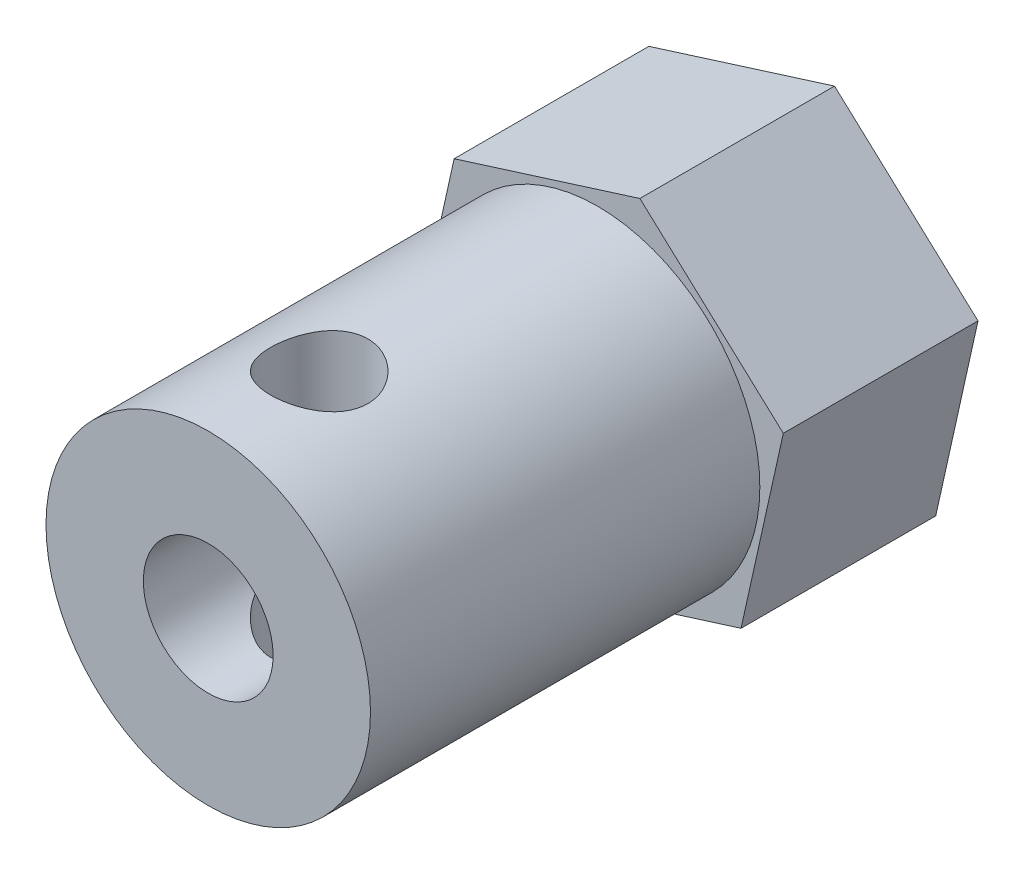
ISO-10303-21;
HEADER;
FILE_DESCRIPTION(('STEP AP214'),'2;1');
FILE_NAME('part.step','',(''),(''),'','','');
FILE_SCHEMA(('AUTOMOTIVE_DESIGN { 1 0 10303 214 1 1 1 1 }'));
ENDSEC;
DATA;
#1=APPLICATION_CONTEXT('core data for automotive mechanical design processes');
#2=APPLICATION_PROTOCOL_DEFINITION('international standard','automotive_design',2000,#1);
#3=PRODUCT_CONTEXT('',#1,'mechanical');
#4=PRODUCT('Part','Part','',(#3));
#5=PRODUCT_RELATED_PRODUCT_CATEGORY('part','',(#4));
#6=PRODUCT_DEFINITION_FORMATION('','',#4);
#7=PRODUCT_DEFINITION_CONTEXT('part definition',#1,'design');
#8=PRODUCT_DEFINITION('design','',#6,#7);
#9=PRODUCT_DEFINITION_SHAPE('','',#8);
#10=(LENGTH_UNIT() NAMED_UNIT(*) SI_UNIT(.MILLI.,.METRE.));
#11=(NAMED_UNIT(*) PLANE_ANGLE_UNIT() SI_UNIT($,.RADIAN.));
#12=(NAMED_UNIT(*) SI_UNIT($,.STERADIAN.) SOLID_ANGLE_UNIT());
#13=UNCERTAINTY_MEASURE_WITH_UNIT(LENGTH_MEASURE(1.E-05),#10,'distance_accuracy_value','');
#14=(GEOMETRIC_REPRESENTATION_CONTEXT(3) GLOBAL_UNCERTAINTY_ASSIGNED_CONTEXT((#13)) GLOBAL_UNIT_ASSIGNED_CONTEXT((#10,
#11,#12)) REPRESENTATION_CONTEXT('',''));
#15=CARTESIAN_POINT('',(0.,0.,0.));
#16=DIRECTION('',(0.,0.,1.));
#17=DIRECTION('',(1.,0.,0.));
#18=AXIS2_PLACEMENT_3D('',#15,#16,#17);
#19=CARTESIAN_POINT('',(0.,-6.,14.58047771158));
#20=DIRECTION('',(0.,1.,0.));
#21=DIRECTION('',(0.,0.,1.));
#22=AXIS2_PLACEMENT_3D('',#19,#20,#21);
#23=CYLINDRICAL_SURFACE('',#22,1.5);
#24=CARTESIAN_POINT('',(0.,-2.,16.08047771158));
#25=CARTESIAN_POINT('',(0.0732207358411543,-1.99999540196395,16.080472919568));
#26=CARTESIAN_POINT('',(0.146561062021485,-1.99593645526274,16.0750726872055));
#27=CARTESIAN_POINT('',(0.290936396286467,-1.98006607281083,16.0538106481698));
#28=CARTESIAN_POINT('',(0.361965136229004,-1.96823514679854,16.0379225399299));
#29=CARTESIAN_POINT('',(0.499234626631249,-1.9379567495606,15.9967648022962));
#30=CARTESIAN_POINT('',(0.565501615403736,-1.91954951932009,15.9715521980108));
#31=CARTESIAN_POINT('',(0.692422335520752,-1.87750556721694,15.9129353673928));
#32=CARTESIAN_POINT('',(0.753077701796332,-1.85387037535483,15.8795335373865));
#33=CARTESIAN_POINT('',(0.873465937590145,-1.80049544543983,15.8022146999892));
#34=CARTESIAN_POINT('',(0.932593229272033,-1.77039308548439,15.7576103822459));
#35=CARTESIAN_POINT('',(1.04302716767671,-1.70767017883378,15.6609818742188));
#36=CARTESIAN_POINT('',(1.09432148272226,-1.67504578078609,15.6089462287802));
#37=CARTESIAN_POINT('',(1.19837161436623,-1.6027112365199,15.4868947583016));
#38=CARTESIAN_POINT('',(1.24930578421204,-1.56290854864639,15.4153740344583));
#39=CARTESIAN_POINT('',(1.33861998176348,-1.48711444664135,15.2630266992135));
#40=CARTESIAN_POINT('',(1.37701716983077,-1.45111786883675,15.1822130145797));
#41=CARTESIAN_POINT('',(1.42880627811788,-1.39977155180179,15.0409748729038));
#42=CARTESIAN_POINT('',(1.44625674456539,-1.38157751186733,14.9830870144516));
#43=CARTESIAN_POINT('',(1.47420672564844,-1.35171594150685,14.8640849767951));
#44=CARTESIAN_POINT('',(1.48472215355267,-1.34003347910832,14.8029785337052));
#45=CARTESIAN_POINT('',(1.49812822141445,-1.32503759684553,14.6782951260492));
#46=CARTESIAN_POINT('',(1.50094954854207,-1.32180026676597,14.6147009048559));
#47=CARTESIAN_POINT('',(1.49848213241869,-1.32459531776068,14.4878628006984));
#48=CARTESIAN_POINT('',(1.49319048157349,-1.33063102218113,14.4246190514926));
#49=CARTESIAN_POINT('',(1.47597739291882,-1.34967623262519,14.3072863641542));
#50=CARTESIAN_POINT('',(1.46482486380817,-1.36187157059871,14.2529413405338));
#51=CARTESIAN_POINT('',(1.43705671120733,-1.39114192844939,14.1470388328591));
#52=CARTESIAN_POINT('',(1.42043583681172,-1.40822163640769,14.0954840837564));
#53=CARTESIAN_POINT('',(1.37033064172535,-1.45741769294306,13.9642213249459));
#54=CARTESIAN_POINT('',(1.3328014849398,-1.49225649139232,13.8870772949365));
#55=CARTESIAN_POINT('',(1.24618023314519,-1.56533298145196,13.7412811877109));
#56=CARTESIAN_POINT('',(1.19706004255879,-1.60357878886109,13.6726503723253));
#57=CARTESIAN_POINT('',(1.08651604102136,-1.68051672313145,13.5427243211763));
#58=CARTESIAN_POINT('',(1.02481375526037,-1.71919586730239,13.4816571046985));
#59=CARTESIAN_POINT('',(0.890422521709593,-1.79248037980972,13.3702140647988));
#60=CARTESIAN_POINT('',(0.817755054293761,-1.8270934826376,13.3198177913496));
#61=CARTESIAN_POINT('',(0.677902080454147,-1.88279726073643,13.2404969123397));
#62=CARTESIAN_POINT('',(0.612539870185624,-1.90520770945008,13.2092931173642));
#63=CARTESIAN_POINT('',(0.476352173202091,-1.94372904416947,13.1562528311161));
#64=CARTESIAN_POINT('',(0.405530141063771,-1.95984387504351,13.1344104730807));
#65=CARTESIAN_POINT('',(0.259676232483523,-1.98445588635989,13.1012243486936));
#66=CARTESIAN_POINT('',(0.184621281405948,-1.99290592971749,13.0899455326414));
#67=CARTESIAN_POINT('',(0.0332012397969221,-2.00115883659445,13.0789281142083));
#68=CARTESIAN_POINT('',(-0.0431632843727186,-2.00096534845408,13.0791846428846));
#69=CARTESIAN_POINT('',(-0.186804217329621,-1.99242547175873,13.0905885808532));
#70=CARTESIAN_POINT('',(-0.254222327546129,-1.98490086600401,13.1006382484687));
#71=CARTESIAN_POINT('',(-0.386110670609114,-1.96351320201588,13.1294514915879));
#72=CARTESIAN_POINT('',(-0.450580272987257,-1.94964879507262,13.1482169212694));
#73=CARTESIAN_POINT('',(-0.577416779689765,-1.91599830683313,13.1943652421731));
#74=CARTESIAN_POINT('',(-0.639629172536135,-1.89602050290194,13.2220288930074));
#75=CARTESIAN_POINT('',(-0.758518527043069,-1.85166985411963,13.2846501670056));
#76=CARTESIAN_POINT('',(-0.815194721336399,-1.82729640132068,13.3196087992197));
#77=CARTESIAN_POINT('',(-0.931511626319033,-1.77119146886499,13.4022609579906));
#78=CARTESIAN_POINT('',(-0.990066762698698,-1.73891095025037,13.4511062510174));
#79=CARTESIAN_POINT('',(-1.09871974855853,-1.67238952874785,13.5564864641684));
#80=CARTESIAN_POINT('',(-1.14879830469576,-1.63814438507395,13.6130384112733));
#81=CARTESIAN_POINT('',(-1.24877541075626,-1.56369128291497,13.7446275925412));
#82=CARTESIAN_POINT('',(-1.29683043648704,-1.52358718520101,13.8211352730723));
#83=CARTESIAN_POINT('',(-1.37923235998282,-1.44940591348451,13.9838377895524));
#84=CARTESIAN_POINT('',(-1.41362000515519,-1.41531099570969,14.0700028334886));
#85=CARTESIAN_POINT('',(-1.45615734256767,-1.37118877808583,14.2158921604545));
#86=CARTESIAN_POINT('',(-1.46931009512995,-1.35695811824565,14.2728688379824));
#87=CARTESIAN_POINT('',(-1.48891522181906,-1.33542056103011,14.3891847585632));
#88=CARTESIAN_POINT('',(-1.4953825519924,-1.32809821220233,14.4485184183822));
#89=CARTESIAN_POINT('',(-1.50115320209064,-1.32157601792209,14.5683067913913));
#90=CARTESIAN_POINT('',(-1.50042015325262,-1.32241740684975,14.6287656545896));
#91=CARTESIAN_POINT('',(-1.49176883838219,-1.33216448543666,14.7485345503321));
#92=CARTESIAN_POINT('',(-1.48384130024585,-1.34108058157484,14.8078429994772));
#93=CARTESIAN_POINT('',(-1.45893841819723,-1.36817348797772,14.9363922829908));
#94=CARTESIAN_POINT('',(-1.44036567954112,-1.38794705950643,15.0049748917128));
#95=CARTESIAN_POINT('',(-1.39469627266119,-1.4338296338541,15.1370125604105));
#96=CARTESIAN_POINT('',(-1.3675780729773,-1.45995460146929,15.2004541536182));
#97=CARTESIAN_POINT('',(-1.29498918933643,-1.52516477328823,15.3429983420663));
#98=CARTESIAN_POINT('',(-1.24641542065971,-1.56560203191104,15.4198992943357));
#99=CARTESIAN_POINT('',(-1.13650718465937,-1.64713510181272,15.5636037565576));
#100=CARTESIAN_POINT('',(-1.07516134758578,-1.68823146954222,15.6303981775248));
#101=CARTESIAN_POINT('',(-0.939627144937899,-1.76728988939793,15.7533095538633));
#102=CARTESIAN_POINT('',(-0.865337161562867,-1.80522333711071,15.8093340309572));
#103=CARTESIAN_POINT('',(-0.705159098936212,-1.87357289668096,15.9077007627253));
#104=CARTESIAN_POINT('',(-0.619299420401804,-1.90400691592958,15.9500756861525));
#105=CARTESIAN_POINT('',(-0.464840290356466,-1.94636704624047,16.0082771325657));
#106=CARTESIAN_POINT('',(-0.398553614774744,-1.96110322499718,16.0282444429562));
#107=CARTESIAN_POINT('',(-0.262841610392771,-1.98383739970237,16.0588956141915));
#108=CARTESIAN_POINT('',(-0.193425623834917,-1.99185421210894,16.06960540183));
#109=CARTESIAN_POINT('',(-0.102963309861899,-1.99745471706309,16.0770824057943));
#110=CARTESIAN_POINT('',(-0.0824069459941317,-1.9984076143208,16.0783539890694));
#111=CARTESIAN_POINT('',(-0.0412368896243824,-1.99968095423138,16.080052384811));
#112=CARTESIAN_POINT('',(-0.0206231884283902,-2.00000129507253,16.0804790612874));
#113=CARTESIAN_POINT('',(0.,-2.,16.08047771158));
#114=B_SPLINE_CURVE_WITH_KNOTS('',3,(#24,#25,#26,#27,#28,#29,#30,#31,#32,#33,#34,#35,#36,#37,
#38,#39,#40,#41,#42,#43,#44,#45,#46,#47,#48,#49,#50,#51,#52,#53,#54,#55,#56,#57,#58,#59,#60,#61,
#62,#63,#64,#65,#66,#67,#68,#69,#70,#71,#72,#73,#74,#75,#76,#77,#78,#79,#80,#81,#82,#83,#84,#85,
#86,#87,#88,#89,#90,#91,#92,#93,#94,#95,#96,#97,#98,#99,#100,#101,#102,#103,#104,#105,#106,#107,
#108,#109,#110,#111,#112,#113),.UNSPECIFIED.,.T.,.F.,(4,2,2,2,2,2,2,2,2,2,2,2,2,2,2,2,2,2,2,2,2,
2,2,2,2,2,2,2,2,2,2,2,2,2,2,2,2,2,2,2,2,2,2,2,4),(0.,0.219571786572042,0.439696319423243,
0.658496333573379,0.877232398849292,1.1162243131743,1.35558868405162,1.64360015887451,
1.93121574056507,2.11999518529901,2.3083399319529,2.49837587621256,2.6884799430021,
2.85826890162709,3.02822137600639,3.30449331805909,3.58144192357889,3.8653588393809,
4.1487266249369,4.37526505006389,4.60166129643117,4.82944058166898,5.05712372466613,
5.26191187011994,5.46674360185812,5.67880439483679,5.8908945397754,6.13840382081867,
6.38646908985451,6.68168596015946,6.97601595850112,7.15589161422932,7.33536399114208,
7.5157433385474,7.69635548563853,7.91639670960133,8.1369968513992,8.43412246655767,
8.73151372390892,9.03135449492649,9.33047220273163,9.54195697541629,9.75284752283255,
9.8146816687871,9.87652576630965),.UNSPECIFIED.);
#115=CARTESIAN_POINT('',(0.,-2.,16.08047771158));
#116=VERTEX_POINT('',#115);
#117=EDGE_CURVE('E168',#116,#116,#114,.T.);
#118=ORIENTED_EDGE('',*,*,#117,.T.);
#119=EDGE_LOOP('',(#118));
#120=FACE_BOUND('',#119,.T.);
#121=CARTESIAN_POINT('',(0.,-5.,16.08047771158));
#122=CARTESIAN_POINT('',(0.0822886127533,-4.9999992925055,16.0804767140951));
#123=CARTESIAN_POINT('',(0.16458731835153,-4.99794915693954,16.073683847956));
#124=CARTESIAN_POINT('',(0.326788125304881,-4.98997105593691,16.0467563573579));
#125=CARTESIAN_POINT('',(0.40668950441142,-4.98404193389692,16.0266177535566));
#126=CARTESIAN_POINT('',(0.561732707754527,-4.96895552501836,15.9737316946697));
#127=CARTESIAN_POINT('',(0.636881364395374,-4.95980300250425,15.9410028419611));
#128=CARTESIAN_POINT('',(0.780624181053132,-4.93922109237645,15.8639416185242));
#129=CARTESIAN_POINT('',(0.84921746746967,-4.92779140192067,15.8196077041846));
#130=CARTESIAN_POINT('',(0.979871797183745,-4.90350737192774,15.7192537041073));
#131=CARTESIAN_POINT('',(1.04171807124434,-4.89062383657036,15.6629610856941));
#132=CARTESIAN_POINT('',(1.15524920923324,-4.86505834210442,15.5408684816698));
#133=CARTESIAN_POINT('',(1.20693236327441,-4.85237641724501,15.475066899455));
#134=CARTESIAN_POINT('',(1.29980037723708,-4.82834113993772,15.3340069585424));
#135=CARTESIAN_POINT('',(1.34072309022213,-4.81702406663875,15.2585692505893));
#136=CARTESIAN_POINT('',(1.4092139477476,-4.79743620394031,15.1014884573497));
#137=CARTESIAN_POINT('',(1.43678529919973,-4.78916468313311,15.019846867652));
#138=CARTESIAN_POINT('',(1.47701633682652,-4.77690870838434,14.8550874454495));
#139=CARTESIAN_POINT('',(1.49007196234677,-4.77281069324533,14.7720749677161));
#140=CARTESIAN_POINT('',(1.50213730614672,-4.76902789749767,14.6049445553632));
#141=CARTESIAN_POINT('',(1.50115042761078,-4.76934204760571,14.5208268935209));
#142=CARTESIAN_POINT('',(1.48546977199812,-4.77424744067778,14.3570938029715));
#143=CARTESIAN_POINT('',(1.47127205262685,-4.7786838859914,14.2774254612178));
#144=CARTESIAN_POINT('',(1.43037420427056,-4.79108356228624,14.1216579253065));
#145=CARTESIAN_POINT('',(1.40367284141641,-4.79904714132351,14.0455590842057));
#146=CARTESIAN_POINT('',(1.33816026653682,-4.81772733074973,13.8978773619193));
#147=CARTESIAN_POINT('',(1.29918816934642,-4.82848016115952,13.8263706276247));
#148=CARTESIAN_POINT('',(1.21035222588683,-4.85150987000065,13.6907456895698));
#149=CARTESIAN_POINT('',(1.16048574002588,-4.86378711746991,13.6266292821662));
#150=CARTESIAN_POINT('',(1.04881290765546,-4.88911011297937,13.504791520818));
#151=CARTESIAN_POINT('',(0.986594907466973,-4.90216654310498,13.4474490475503));
#152=CARTESIAN_POINT('',(0.853263259313967,-4.92712244063259,13.3439237275157));
#153=CARTESIAN_POINT('',(0.782149051860888,-4.9390218351841,13.2977415831656));
#154=CARTESIAN_POINT('',(0.632355038342802,-4.9604316006947,13.2176177891153));
#155=CARTESIAN_POINT('',(0.553627749747949,-4.96992543668314,13.1837601953301));
#156=CARTESIAN_POINT('',(0.391245415603518,-4.98533521832222,13.1298781214804));
#157=CARTESIAN_POINT('',(0.307591751589581,-4.99125216186999,13.1098497830475));
#158=CARTESIAN_POINT('',(0.140952242668331,-4.99868364643538,13.0848255336806));
#159=CARTESIAN_POINT('',(0.0580500976011865,-5.0003485041779,13.0793161257784));
#160=CARTESIAN_POINT('',(-0.107499605823384,-4.9995292324176,13.0820468672921));
#161=CARTESIAN_POINT('',(-0.190147196690782,-4.99704565677756,13.0902851812314));
#162=CARTESIAN_POINT('',(-0.350903605309698,-4.98830696987163,13.1198623226915));
#163=CARTESIAN_POINT('',(-0.42907277261417,-4.98213829799417,13.1409010991609));
#164=CARTESIAN_POINT('',(-0.580754638954523,-4.96674347841533,13.1951209443582));
#165=CARTESIAN_POINT('',(-0.654266777025584,-4.95751696321085,13.2283034726179));
#166=CARTESIAN_POINT('',(-0.796437189461053,-4.93669654351325,13.3067308770611));
#167=CARTESIAN_POINT('',(-0.86494382619967,-4.92505280829675,13.352237052528));
#168=CARTESIAN_POINT('',(-0.993523307980147,-4.90073468764318,13.4537024656328));
#169=CARTESIAN_POINT('',(-1.05359403235594,-4.8880600443108,13.5096643234677));
#170=CARTESIAN_POINT('',(-1.16585744551027,-4.86253171869138,13.6328650199493));
#171=CARTESIAN_POINT('',(-1.21768481231504,-4.84968825033268,13.7004395873517));
#172=CARTESIAN_POINT('',(-1.30928995072154,-4.82576515238463,13.8436056505935));
#173=CARTESIAN_POINT('',(-1.34906803829472,-4.81468547654651,13.9191969361382));
#174=CARTESIAN_POINT('',(-1.41517347127168,-4.79567189615055,14.0760102028347));
#175=CARTESIAN_POINT('',(-1.4415634693705,-4.78772337843827,14.1572038981166));
#176=CARTESIAN_POINT('',(-1.48021730815114,-4.77591594362794,14.3231656805115));
#177=CARTESIAN_POINT('',(-1.49248598978779,-4.772055625083,14.4079325323677));
#178=CARTESIAN_POINT('',(-1.50221984485059,-4.76899972496087,14.5748392299562));
#179=CARTESIAN_POINT('',(-1.5002805530849,-4.76961647442755,14.6569413625976));
#180=CARTESIAN_POINT('',(-1.48307505444813,-4.77499401288294,14.8195918149528));
#181=CARTESIAN_POINT('',(-1.46780938124716,-4.77975463592551,14.9001401967564));
#182=CARTESIAN_POINT('',(-1.42476888804136,-4.79275763670385,15.0564231107228));
#183=CARTESIAN_POINT('',(-1.39715175507068,-4.80095604545965,15.1322049989417));
#184=CARTESIAN_POINT('',(-1.33031507121129,-4.81990278909136,15.2781201503977));
#185=CARTESIAN_POINT('',(-1.29109329962876,-4.83065161194312,15.3482523292208));
#186=CARTESIAN_POINT('',(-1.20048763805072,-4.85397676425833,15.4836408281071));
#187=CARTESIAN_POINT('',(-1.14871276092994,-4.86660540163798,15.5486264728404));
#188=CARTESIAN_POINT('',(-1.03517434629782,-4.89201320450026,15.6691802098879));
#189=CARTESIAN_POINT('',(-0.9734082171345,-4.90479240823905,15.7247458510478));
#190=CARTESIAN_POINT('',(-0.839465762183247,-4.92950936570649,15.826501123875));
#191=CARTESIAN_POINT('',(-0.767037885790606,-4.94141159765674,15.8723691584355));
#192=CARTESIAN_POINT('',(-0.615141373983529,-4.96260680455813,15.951212881484));
#193=CARTESIAN_POINT('',(-0.535676052998955,-4.97190099931067,15.9841945998545));
#194=CARTESIAN_POINT('',(-0.380757712655281,-4.98602174969301,16.0333729872327));
#195=CARTESIAN_POINT('',(-0.305786961954234,-4.99122027381068,16.0509893844632));
#196=CARTESIAN_POINT('',(-0.15388019523078,-4.99820944494492,16.0745412368216));
#197=CARTESIAN_POINT('',(-0.0769445098581396,-5.0000006615474,16.0804786442848));
#198=CARTESIAN_POINT('',(0.,-5.,16.08047771158));
#199=B_SPLINE_CURVE_WITH_KNOTS('',3,(#121,#122,#123,#124,#125,#126,#127,#128,#129,#130,#131,
#132,#133,#134,#135,#136,#137,#138,#139,#140,#141,#142,#143,#144,#145,#146,#147,#148,#149,#150,
#151,#152,#153,#154,#155,#156,#157,#158,#159,#160,#161,#162,#163,#164,#165,#166,#167,#168,#169,
#170,#171,#172,#173,#174,#175,#176,#177,#178,#179,#180,#181,#182,#183,#184,#185,#186,#187,#188,
#189,#190,#191,#192,#193,#194,#195,#196,#197,#198),.UNSPECIFIED.,.T.,.F.,(4,2,2,2,2,2,2,2,2,2,2,
2,2,2,2,2,2,2,2,2,2,2,2,2,2,2,2,2,2,2,2,2,2,2,2,2,2,2,4),(0.,0.246583203612611,0.493239964846,
0.739533676300875,0.985860164412702,1.23855602948191,1.49129437288633,1.74971481004109,
2.00807314543224,2.25919689356599,2.51025978319089,2.75226016697676,2.99428443658001,
3.23962426447119,3.48502360158555,3.74067104048166,3.99633456531071,4.25371046881689,
4.51101453528808,4.75908809438545,5.00712853550327,5.24956746682327,5.49203554593729,
5.74011305702908,5.98825282000191,6.24540400322819,6.5025484425268,6.75847814951252,
7.01432009460283,7.25950155466943,7.504673196616,7.74680040402721,7.98897397553107,
8.23996925679931,8.49102974897502,8.74942996156671,9.00770911595235,9.23831691930459,
9.46888616948874),.UNSPECIFIED.);
#200=CARTESIAN_POINT('',(0.,-5.,16.08047771158));
#201=VERTEX_POINT('',#200);
#202=EDGE_CURVE('E167',#201,#201,#199,.T.);
#203=ORIENTED_EDGE('',*,*,#202,.F.);
#204=EDGE_LOOP('',(#203));
#205=FACE_BOUND('',#204,.T.);
#206=ADVANCED_FACE('F39',(#120,#205),#23,.F.);
#207=CARTESIAN_POINT('',(1.30261905766048,5.85689197361704,6.));
#208=DIRECTION('',(0.300057465236799,-0.953921127533963,0.));
#209=DIRECTION('',(0.953921127533963,0.300057465236799,0.));
#210=AXIS2_PLACEMENT_3D('',#207,#208,#209);
#211=PLANE('',#210);
#212=DIRECTION('',(-0.953921127533963,-0.300057465236799,0.));
#213=VECTOR('',#212,1.);
#214=CARTESIAN_POINT('',(1.30261905766048,5.85689197361704,0.));
#215=LINE('',#214,#213);
#216=CARTESIAN_POINT('',(1.30261905766048,5.85689197361704,0.));
#217=VERTEX_POINT('',#216);
#218=CARTESIAN_POINT('',(-4.42090770754329,4.05654718219625,0.));
#219=VERTEX_POINT('',#218);
#220=EDGE_CURVE('E131',#217,#219,#215,.T.);
#221=ORIENTED_EDGE('',*,*,#220,.T.);
#222=DIRECTION('',(0.,0.,-1.));
#223=VECTOR('',#222,1.);
#224=CARTESIAN_POINT('',(-4.42090770754329,4.05654718219625,6.));
#225=LINE('',#224,#223);
#226=CARTESIAN_POINT('',(-4.42090770754329,4.05654718219625,6.));
#227=VERTEX_POINT('',#226);
#228=EDGE_CURVE('E11',#227,#219,#225,.T.);
#229=ORIENTED_EDGE('',*,*,#228,.F.);
#230=DIRECTION('',(-0.953921127533963,-0.300057465236799,0.));
#231=VECTOR('',#230,1.);
#232=CARTESIAN_POINT('',(1.30261905766048,5.85689197361704,6.));
#233=LINE('',#232,#231);
#234=CARTESIAN_POINT('',(1.30261905766048,5.85689197361704,6.));
#235=VERTEX_POINT('',#234);
#236=EDGE_CURVE('E148',#235,#227,#233,.T.);
#237=ORIENTED_EDGE('',*,*,#236,.F.);
#238=DIRECTION('',(0.,0.,-1.));
#239=VECTOR('',#238,1.);
#240=CARTESIAN_POINT('',(1.30261905766048,5.85689197361704,6.));
#241=LINE('',#240,#239);
#242=EDGE_CURVE('E127',#235,#217,#241,.T.);
#243=ORIENTED_EDGE('',*,*,#242,.T.);
#244=EDGE_LOOP('',(#221,#229,#237,#243));
#245=FACE_BOUND('',#244,.T.);
#246=ADVANCED_FACE('F41',(#245),#211,.F.);
#247=CARTESIAN_POINT('',(-4.42090770754329,4.05654718219625,6.));
#248=DIRECTION('',(0.976148662269507,-0.217103176276748,0.));
#249=DIRECTION('',(0.217103176276748,0.976148662269507,0.));
#250=AXIS2_PLACEMENT_3D('',#247,#248,#249);
#251=PLANE('',#250);
#252=DIRECTION('',(-0.217103176276748,-0.976148662269507,0.));
#253=VECTOR('',#252,1.);
#254=CARTESIAN_POINT('',(-4.42090770754329,4.05654718219625,0.));
#255=LINE('',#254,#253);
#256=CARTESIAN_POINT('',(-5.72352676520378,-1.80034479142079,0.));
#257=VERTEX_POINT('',#256);
#258=EDGE_CURVE('E135',#219,#257,#255,.T.);
#259=ORIENTED_EDGE('',*,*,#258,.T.);
#260=DIRECTION('',(0.,0.,-1.));
#261=VECTOR('',#260,1.);
#262=CARTESIAN_POINT('',(-5.72352676520378,-1.80034479142079,6.));
#263=LINE('',#262,#261);
#264=CARTESIAN_POINT('',(-5.72352676520378,-1.80034479142079,6.));
#265=VERTEX_POINT('',#264);
#266=EDGE_CURVE('E50',#265,#257,#263,.T.);
#267=ORIENTED_EDGE('',*,*,#266,.F.);
#268=DIRECTION('',(-0.217103176276748,-0.976148662269507,0.));
#269=VECTOR('',#268,1.);
#270=CARTESIAN_POINT('',(-4.42090770754329,4.05654718219625,6.));
#271=LINE('',#270,#269);
#272=EDGE_CURVE('E96',#227,#265,#271,.T.);
#273=ORIENTED_EDGE('',*,*,#272,.F.);
#274=ORIENTED_EDGE('',*,*,#228,.T.);
#275=EDGE_LOOP('',(#259,#267,#273,#274));
#276=FACE_BOUND('',#275,.T.);
#277=ADVANCED_FACE('F219',(#276),#251,.F.);
#278=CARTESIAN_POINT('',(-5.72352676520378,-1.80034479142079,6.));
#279=DIRECTION('',(0.676091197032708,0.736817951257215,0.));
#280=DIRECTION('',(-0.736817951257215,0.676091197032708,0.));
#281=AXIS2_PLACEMENT_3D('',#278,#279,#280);
#282=PLANE('',#281);
#283=DIRECTION('',(0.736817951257215,-0.676091197032708,0.));
#284=VECTOR('',#283,1.);
#285=CARTESIAN_POINT('',(-5.72352676520378,-1.80034479142079,0.));
#286=LINE('',#285,#284);
#287=CARTESIAN_POINT('',(-1.30261905766049,-5.85689197361704,0.));
#288=VERTEX_POINT('',#287);
#289=EDGE_CURVE('E139',#257,#288,#286,.T.);
#290=ORIENTED_EDGE('',*,*,#289,.T.);
#291=DIRECTION('',(0.,0.,-1.));
#292=VECTOR('',#291,1.);
#293=CARTESIAN_POINT('',(-1.30261905766049,-5.85689197361704,6.));
#294=LINE('',#293,#292);
#295=CARTESIAN_POINT('',(-1.30261905766049,-5.85689197361704,6.));
#296=VERTEX_POINT('',#295);
#297=EDGE_CURVE('E120',#296,#288,#294,.T.);
#298=ORIENTED_EDGE('',*,*,#297,.F.);
#299=DIRECTION('',(0.736817951257215,-0.676091197032708,0.));
#300=VECTOR('',#299,1.);
#301=CARTESIAN_POINT('',(-5.72352676520378,-1.80034479142079,6.));
#302=LINE('',#301,#300);
#303=EDGE_CURVE('E109',#265,#296,#302,.T.);
#304=ORIENTED_EDGE('',*,*,#303,.F.);
#305=ORIENTED_EDGE('',*,*,#266,.T.);
#306=EDGE_LOOP('',(#290,#298,#304,#305));
#307=FACE_BOUND('',#306,.T.);
#308=ADVANCED_FACE('F224',(#307),#282,.F.);
#309=CARTESIAN_POINT('',(-1.30261905766049,-5.85689197361704,6.));
#310=DIRECTION('',(-0.300057465236798,0.953921127533963,0.));
#311=DIRECTION('',(-0.953921127533963,-0.300057465236798,0.));
#312=AXIS2_PLACEMENT_3D('',#309,#310,#311);
#313=PLANE('',#312);
#314=DIRECTION('',(0.953921127533963,0.300057465236798,0.));
#315=VECTOR('',#314,1.);
#316=CARTESIAN_POINT('',(-1.30261905766049,-5.85689197361704,0.));
#317=LINE('',#316,#315);
#318=CARTESIAN_POINT('',(4.42090770754329,-4.05654718219625,0.));
#319=VERTEX_POINT('',#318);
#320=EDGE_CURVE('E118',#288,#319,#317,.T.);
#321=ORIENTED_EDGE('',*,*,#320,.T.);
#322=DIRECTION('',(0.,0.,-1.));
#323=VECTOR('',#322,1.);
#324=CARTESIAN_POINT('',(4.42090770754329,-4.05654718219625,6.));
#325=LINE('',#324,#323);
#326=CARTESIAN_POINT('',(4.42090770754329,-4.05654718219625,6.));
#327=VERTEX_POINT('',#326);
#328=EDGE_CURVE('E115',#327,#319,#325,.T.);
#329=ORIENTED_EDGE('',*,*,#328,.F.);
#330=DIRECTION('',(0.953921127533963,0.300057465236798,0.));
#331=VECTOR('',#330,1.);
#332=CARTESIAN_POINT('',(-1.30261905766049,-5.85689197361704,6.));
#333=LINE('',#332,#331);
#334=EDGE_CURVE('E103',#296,#327,#333,.T.);
#335=ORIENTED_EDGE('',*,*,#334,.F.);
#336=ORIENTED_EDGE('',*,*,#297,.T.);
#337=EDGE_LOOP('',(#321,#329,#335,#336));
#338=FACE_BOUND('',#337,.T.);
#339=ADVANCED_FACE('F116',(#338),#313,.F.);
#340=CARTESIAN_POINT('',(4.42090770754329,-4.05654718219625,6.));
#341=DIRECTION('',(-0.976148662269507,0.217103176276747,0.));
#342=DIRECTION('',(-0.217103176276747,-0.976148662269507,0.));
#343=AXIS2_PLACEMENT_3D('',#340,#341,#342);
#344=PLANE('',#343);
#345=DIRECTION('',(0.217103176276747,0.976148662269507,0.));
#346=VECTOR('',#345,1.);
#347=CARTESIAN_POINT('',(4.42090770754329,-4.05654718219625,0.));
#348=LINE('',#347,#346);
#349=CARTESIAN_POINT('',(5.72352676520378,1.80034479142079,0.));
#350=VERTEX_POINT('',#349);
#351=EDGE_CURVE('E82',#319,#350,#348,.T.);
#352=ORIENTED_EDGE('',*,*,#351,.T.);
#353=DIRECTION('',(0.,0.,-1.));
#354=VECTOR('',#353,1.);
#355=CARTESIAN_POINT('',(5.72352676520378,1.80034479142079,6.));
#356=LINE('',#355,#354);
#357=CARTESIAN_POINT('',(5.72352676520378,1.80034479142079,6.));
#358=VERTEX_POINT('',#357);
#359=EDGE_CURVE('E121',#358,#350,#356,.T.);
#360=ORIENTED_EDGE('',*,*,#359,.F.);
#361=DIRECTION('',(0.217103176276747,0.976148662269507,0.));
#362=VECTOR('',#361,1.);
#363=CARTESIAN_POINT('',(4.42090770754329,-4.05654718219625,6.));
#364=LINE('',#363,#362);
#365=EDGE_CURVE('E107',#327,#358,#364,.T.);
#366=ORIENTED_EDGE('',*,*,#365,.F.);
#367=ORIENTED_EDGE('',*,*,#328,.T.);
#368=EDGE_LOOP('',(#352,#360,#366,#367));
#369=FACE_BOUND('',#368,.T.);
#370=ADVANCED_FACE('F123',(#369),#344,.F.);
#371=CARTESIAN_POINT('',(5.72352676520378,1.80034479142079,6.));
#372=DIRECTION('',(-0.676091197032708,-0.736817951257215,0.));
#373=DIRECTION('',(0.736817951257215,-0.676091197032708,0.));
#374=AXIS2_PLACEMENT_3D('',#371,#372,#373);
#375=PLANE('',#374);
#376=DIRECTION('',(-0.736817951257215,0.676091197032708,0.));
#377=VECTOR('',#376,1.);
#378=CARTESIAN_POINT('',(5.72352676520378,1.80034479142079,0.));
#379=LINE('',#378,#377);
#380=EDGE_CURVE('E88',#350,#217,#379,.T.);
#381=ORIENTED_EDGE('',*,*,#380,.T.);
#382=ORIENTED_EDGE('',*,*,#242,.F.);
#383=DIRECTION('',(-0.736817951257215,0.676091197032708,0.));
#384=VECTOR('',#383,1.);
#385=CARTESIAN_POINT('',(5.72352676520378,1.80034479142079,6.));
#386=LINE('',#385,#384);
#387=EDGE_CURVE('E59',#358,#235,#386,.T.);
#388=ORIENTED_EDGE('',*,*,#387,.F.);
#389=ORIENTED_EDGE('',*,*,#359,.T.);
#390=EDGE_LOOP('',(#381,#382,#388,#389));
#391=FACE_BOUND('',#390,.T.);
#392=ADVANCED_FACE('F276',(#391),#375,.F.);
#393=CARTESIAN_POINT('',(0.,0.,6.));
#394=DIRECTION('',(0.,0.,1.));
#395=DIRECTION('',(1.,0.,0.));
#396=AXIS2_PLACEMENT_3D('',#393,#394,#395);
#397=PLANE('',#396);
#398=CARTESIAN_POINT('',(0.,0.,6.));
#399=DIRECTION('',(0.,0.,1.));
#400=DIRECTION('',(1.,0.,0.));
#401=AXIS2_PLACEMENT_3D('',#398,#399,#400);
#402=CIRCLE('',#401,5.);
#403=CARTESIAN_POINT('',(5.,0.,6.));
#404=VERTEX_POINT('',#403);
#405=EDGE_CURVE('E238',#404,#404,#402,.T.);
#406=ORIENTED_EDGE('',*,*,#405,.F.);
#407=EDGE_LOOP('',(#406));
#408=FACE_BOUND('',#407,.T.);
#409=ORIENTED_EDGE('',*,*,#236,.T.);
#410=ORIENTED_EDGE('',*,*,#272,.T.);
#411=ORIENTED_EDGE('',*,*,#303,.T.);
#412=ORIENTED_EDGE('',*,*,#334,.T.);
#413=ORIENTED_EDGE('',*,*,#365,.T.);
#414=ORIENTED_EDGE('',*,*,#387,.T.);
#415=EDGE_LOOP('',(#409,#410,#411,#412,#413,#414));
#416=FACE_BOUND('',#415,.T.);
#417=ADVANCED_FACE('F105',(#408,#416),#397,.T.);
#418=CARTESIAN_POINT('',(0.,0.,0.));
#419=DIRECTION('',(0.,0.,1.));
#420=DIRECTION('',(1.,0.,0.));
#421=AXIS2_PLACEMENT_3D('',#418,#419,#420);
#422=PLANE('',#421);
#423=CARTESIAN_POINT('',(0.,0.,0.));
#424=DIRECTION('',(0.,0.,-1.));
#425=DIRECTION('',(-1.,0.,0.));
#426=AXIS2_PLACEMENT_3D('',#423,#424,#425);
#427=CIRCLE('',#426,1.5);
#428=CARTESIAN_POINT('',(-1.5,0.,0.));
#429=VERTEX_POINT('',#428);
#430=EDGE_CURVE('E252',#429,#429,#427,.T.);
#431=ORIENTED_EDGE('',*,*,#430,.F.);
#432=EDGE_LOOP('',(#431));
#433=FACE_BOUND('',#432,.T.);
#434=ORIENTED_EDGE('',*,*,#220,.F.);
#435=ORIENTED_EDGE('',*,*,#380,.F.);
#436=ORIENTED_EDGE('',*,*,#351,.F.);
#437=ORIENTED_EDGE('',*,*,#320,.F.);
#438=ORIENTED_EDGE('',*,*,#289,.F.);
#439=ORIENTED_EDGE('',*,*,#258,.F.);
#440=EDGE_LOOP('',(#434,#435,#436,#437,#438,#439));
#441=FACE_BOUND('',#440,.T.);
#442=ADVANCED_FACE('F229',(#433,#441),#422,.F.);
#443=CARTESIAN_POINT('',(0.,0.,18.));
#444=DIRECTION('',(0.,0.,-1.));
#445=DIRECTION('',(-1.,0.,0.));
#446=AXIS2_PLACEMENT_3D('',#443,#444,#445);
#447=CYLINDRICAL_SURFACE('',#446,5.);
#448=ORIENTED_EDGE('',*,*,#202,.T.);
#449=EDGE_LOOP('',(#448));
#450=FACE_BOUND('',#449,.T.);
#451=CARTESIAN_POINT('',(0.,5.,16.08047771158));
#452=CARTESIAN_POINT('',(-0.0822886127533,4.9999992925055,16.0804767140951));
#453=CARTESIAN_POINT('',(-0.16458731835153,4.99794915693954,16.073683847956));
#454=CARTESIAN_POINT('',(-0.326788125304881,4.98997105593691,16.0467563573579));
#455=CARTESIAN_POINT('',(-0.40668950441142,4.98404193389692,16.0266177535566));
#456=CARTESIAN_POINT('',(-0.561732707754527,4.96895552501836,15.9737316946697));
#457=CARTESIAN_POINT('',(-0.636881364395374,4.95980300250425,15.9410028419611));
#458=CARTESIAN_POINT('',(-0.780624181053132,4.93922109237645,15.8639416185242));
#459=CARTESIAN_POINT('',(-0.84921746746967,4.92779140192067,15.8196077041846));
#460=CARTESIAN_POINT('',(-0.979871797183745,4.90350737192774,15.7192537041073));
#461=CARTESIAN_POINT('',(-1.04171807124434,4.89062383657036,15.6629610856941));
#462=CARTESIAN_POINT('',(-1.15524920923324,4.86505834210442,15.5408684816698));
#463=CARTESIAN_POINT('',(-1.20693236327441,4.85237641724501,15.475066899455));
#464=CARTESIAN_POINT('',(-1.29980037723708,4.82834113993772,15.3340069585424));
#465=CARTESIAN_POINT('',(-1.34072309022213,4.81702406663875,15.2585692505893));
#466=CARTESIAN_POINT('',(-1.4092139477476,4.79743620394031,15.1014884573497));
#467=CARTESIAN_POINT('',(-1.43678529919973,4.78916468313311,15.019846867652));
#468=CARTESIAN_POINT('',(-1.47701633682652,4.77690870838434,14.8550874454495));
#469=CARTESIAN_POINT('',(-1.49007196234677,4.77281069324533,14.7720749677161));
#470=CARTESIAN_POINT('',(-1.50213730614672,4.76902789749767,14.6049445553632));
#471=CARTESIAN_POINT('',(-1.50115042761078,4.76934204760571,14.5208268935209));
#472=CARTESIAN_POINT('',(-1.48546977199812,4.77424744067778,14.3570938029715));
#473=CARTESIAN_POINT('',(-1.47127205262685,4.7786838859914,14.2774254612178));
#474=CARTESIAN_POINT('',(-1.43037420427056,4.79108356228624,14.1216579253065));
#475=CARTESIAN_POINT('',(-1.40367284141641,4.79904714132351,14.0455590842057));
#476=CARTESIAN_POINT('',(-1.33816026653682,4.81772733074973,13.8978773619193));
#477=CARTESIAN_POINT('',(-1.29918816934642,4.82848016115952,13.8263706276247));
#478=CARTESIAN_POINT('',(-1.21035222588683,4.85150987000065,13.6907456895698));
#479=CARTESIAN_POINT('',(-1.16048574002588,4.86378711746991,13.6266292821662));
#480=CARTESIAN_POINT('',(-1.04881290765546,4.88911011297937,13.504791520818));
#481=CARTESIAN_POINT('',(-0.986594907466973,4.90216654310498,13.4474490475503));
#482=CARTESIAN_POINT('',(-0.853263259313967,4.92712244063259,13.3439237275157));
#483=CARTESIAN_POINT('',(-0.782149051860888,4.9390218351841,13.2977415831656));
#484=CARTESIAN_POINT('',(-0.632355038342802,4.9604316006947,13.2176177891153));
#485=CARTESIAN_POINT('',(-0.553627749747949,4.96992543668314,13.1837601953301));
#486=CARTESIAN_POINT('',(-0.391245415603518,4.98533521832222,13.1298781214804));
#487=CARTESIAN_POINT('',(-0.307591751589581,4.99125216186999,13.1098497830475));
#488=CARTESIAN_POINT('',(-0.140952242668331,4.99868364643538,13.0848255336806));
#489=CARTESIAN_POINT('',(-0.0580500976011865,5.0003485041779,13.0793161257784));
#490=CARTESIAN_POINT('',(0.107499605823384,4.9995292324176,13.0820468672921));
#491=CARTESIAN_POINT('',(0.190147196690782,4.99704565677756,13.0902851812314));
#492=CARTESIAN_POINT('',(0.350903605309698,4.98830696987163,13.1198623226915));
#493=CARTESIAN_POINT('',(0.42907277261417,4.98213829799417,13.1409010991609));
#494=CARTESIAN_POINT('',(0.580754638954523,4.96674347841533,13.1951209443582));
#495=CARTESIAN_POINT('',(0.654266777025584,4.95751696321085,13.2283034726179));
#496=CARTESIAN_POINT('',(0.796437189461053,4.93669654351325,13.3067308770611));
#497=CARTESIAN_POINT('',(0.86494382619967,4.92505280829675,13.352237052528));
#498=CARTESIAN_POINT('',(0.993523307980147,4.90073468764318,13.4537024656328));
#499=CARTESIAN_POINT('',(1.05359403235594,4.8880600443108,13.5096643234677));
#500=CARTESIAN_POINT('',(1.16585744551027,4.86253171869138,13.6328650199493));
#501=CARTESIAN_POINT('',(1.21768481231504,4.84968825033268,13.7004395873517));
#502=CARTESIAN_POINT('',(1.30928995072154,4.82576515238463,13.8436056505935));
#503=CARTESIAN_POINT('',(1.34906803829472,4.81468547654651,13.9191969361382));
#504=CARTESIAN_POINT('',(1.41517347127168,4.79567189615055,14.0760102028347));
#505=CARTESIAN_POINT('',(1.4415634693705,4.78772337843827,14.1572038981166));
#506=CARTESIAN_POINT('',(1.48021730815114,4.77591594362794,14.3231656805115));
#507=CARTESIAN_POINT('',(1.49248598978779,4.772055625083,14.4079325323677));
#508=CARTESIAN_POINT('',(1.50221984485059,4.76899972496087,14.5748392299562));
#509=CARTESIAN_POINT('',(1.5002805530849,4.76961647442755,14.6569413625976));
#510=CARTESIAN_POINT('',(1.48307505444813,4.77499401288294,14.8195918149528));
#511=CARTESIAN_POINT('',(1.46780938124716,4.77975463592551,14.9001401967564));
#512=CARTESIAN_POINT('',(1.42476888804136,4.79275763670385,15.0564231107228));
#513=CARTESIAN_POINT('',(1.39715175507068,4.80095604545965,15.1322049989417));
#514=CARTESIAN_POINT('',(1.33031507121129,4.81990278909136,15.2781201503977));
#515=CARTESIAN_POINT('',(1.29109329962876,4.83065161194312,15.3482523292208));
#516=CARTESIAN_POINT('',(1.20048763805072,4.85397676425833,15.4836408281071));
#517=CARTESIAN_POINT('',(1.14871276092994,4.86660540163798,15.5486264728404));
#518=CARTESIAN_POINT('',(1.03517434629782,4.89201320450026,15.6691802098879));
#519=CARTESIAN_POINT('',(0.9734082171345,4.90479240823905,15.7247458510478));
#520=CARTESIAN_POINT('',(0.839465762183247,4.92950936570649,15.826501123875));
#521=CARTESIAN_POINT('',(0.767037885790606,4.94141159765674,15.8723691584355));
#522=CARTESIAN_POINT('',(0.615141373983529,4.96260680455813,15.951212881484));
#523=CARTESIAN_POINT('',(0.535676052998955,4.97190099931067,15.9841945998545));
#524=CARTESIAN_POINT('',(0.380757712655281,4.98602174969301,16.0333729872327));
#525=CARTESIAN_POINT('',(0.305786961954234,4.99122027381068,16.0509893844632));
#526=CARTESIAN_POINT('',(0.15388019523078,4.99820944494492,16.0745412368216));
#527=CARTESIAN_POINT('',(0.0769445098581396,5.0000006615474,16.0804786442848));
#528=CARTESIAN_POINT('',(0.,5.,16.08047771158));
#529=B_SPLINE_CURVE_WITH_KNOTS('',3,(#451,#452,#453,#454,#455,#456,#457,#458,#459,#460,#461,
#462,#463,#464,#465,#466,#467,#468,#469,#470,#471,#472,#473,#474,#475,#476,#477,#478,#479,#480,
#481,#482,#483,#484,#485,#486,#487,#488,#489,#490,#491,#492,#493,#494,#495,#496,#497,#498,#499,
#500,#501,#502,#503,#504,#505,#506,#507,#508,#509,#510,#511,#512,#513,#514,#515,#516,#517,#518,
#519,#520,#521,#522,#523,#524,#525,#526,#527,#528),.UNSPECIFIED.,.T.,.F.,(4,2,2,2,2,2,2,2,2,2,2,
2,2,2,2,2,2,2,2,2,2,2,2,2,2,2,2,2,2,2,2,2,2,2,2,2,2,2,4),(0.,0.246583203612611,0.493239964846,
0.739533676300875,0.985860164412702,1.23855602948191,1.49129437288633,1.74971481004109,
2.00807314543224,2.25919689356599,2.51025978319089,2.75226016697676,2.99428443658001,
3.23962426447119,3.48502360158555,3.74067104048166,3.99633456531071,4.25371046881689,
4.51101453528808,4.75908809438545,5.00712853550327,5.24956746682327,5.49203554593729,
5.74011305702908,5.98825282000191,6.24540400322819,6.5025484425268,6.75847814951252,
7.01432009460283,7.25950155466943,7.504673196616,7.74680040402721,7.98897397553107,
8.23996925679931,8.49102974897502,8.74942996156671,9.00770911595235,9.23831691930459,
9.46888616948874),.UNSPECIFIED.);
#530=CARTESIAN_POINT('',(0.,5.,16.08047771158));
#531=VERTEX_POINT('',#530);
#532=EDGE_CURVE('E158',#531,#531,#529,.T.);
#533=ORIENTED_EDGE('',*,*,#532,.T.);
#534=EDGE_LOOP('',(#533));
#535=FACE_BOUND('',#534,.T.);
#536=CARTESIAN_POINT('',(0.,0.,18.));
#537=DIRECTION('',(0.,0.,1.));
#538=DIRECTION('',(1.,0.,0.));
#539=AXIS2_PLACEMENT_3D('',#536,#537,#538);
#540=CIRCLE('',#539,5.);
#541=CARTESIAN_POINT('',(5.,0.,18.));
#542=VERTEX_POINT('',#541);
#543=EDGE_CURVE('E136',#542,#542,#540,.T.);
#544=ORIENTED_EDGE('',*,*,#543,.F.);
#545=EDGE_LOOP('',(#544));
#546=FACE_BOUND('',#545,.T.);
#547=ORIENTED_EDGE('',*,*,#405,.T.);
#548=EDGE_LOOP('',(#547));
#549=FACE_BOUND('',#548,.T.);
#550=ADVANCED_FACE('F173',(#450,#535,#546,#549),#447,.T.);
#551=CARTESIAN_POINT('',(0.,0.,18.));
#552=DIRECTION('',(0.,0.,1.));
#553=DIRECTION('',(1.,0.,0.));
#554=AXIS2_PLACEMENT_3D('',#551,#552,#553);
#555=PLANE('',#554);
#556=CARTESIAN_POINT('',(0.,0.,18.));
#557=DIRECTION('',(0.,0.,1.));
#558=DIRECTION('',(1.,0.,0.));
#559=AXIS2_PLACEMENT_3D('',#556,#557,#558);
#560=CIRCLE('',#559,2.);
#561=CARTESIAN_POINT('',(2.,0.,18.));
#562=VERTEX_POINT('',#561);
#563=EDGE_CURVE('E248',#562,#562,#560,.T.);
#564=ORIENTED_EDGE('',*,*,#563,.F.);
#565=EDGE_LOOP('',(#564));
#566=FACE_BOUND('',#565,.T.);
#567=ORIENTED_EDGE('',*,*,#543,.T.);
#568=EDGE_LOOP('',(#567));
#569=FACE_BOUND('',#568,.T.);
#570=ADVANCED_FACE('F182',(#566,#569),#555,.T.);
#571=CARTESIAN_POINT('',(0.,2.,16.08047771158));
#572=CARTESIAN_POINT('',(-0.0732207358411543,1.99999540196395,16.080472919568));
#573=CARTESIAN_POINT('',(-0.146561062021485,1.99593645526274,16.0750726872055));
#574=CARTESIAN_POINT('',(-0.290936396286467,1.98006607281083,16.0538106481698));
#575=CARTESIAN_POINT('',(-0.361965136229004,1.96823514679854,16.0379225399299));
#576=CARTESIAN_POINT('',(-0.499234626631249,1.9379567495606,15.9967648022962));
#577=CARTESIAN_POINT('',(-0.565501615403736,1.91954951932009,15.9715521980108));
#578=CARTESIAN_POINT('',(-0.692422335520752,1.87750556721694,15.9129353673928));
#579=CARTESIAN_POINT('',(-0.753077701796332,1.85387037535483,15.8795335373865));
#580=CARTESIAN_POINT('',(-0.873465937590145,1.80049544543983,15.8022146999892));
#581=CARTESIAN_POINT('',(-0.932593229272033,1.77039308548439,15.7576103822459));
#582=CARTESIAN_POINT('',(-1.04302716767671,1.70767017883378,15.6609818742188));
#583=CARTESIAN_POINT('',(-1.09432148272226,1.67504578078609,15.6089462287802));
#584=CARTESIAN_POINT('',(-1.19837161436623,1.6027112365199,15.4868947583016));
#585=CARTESIAN_POINT('',(-1.24930578421204,1.56290854864639,15.4153740344583));
#586=CARTESIAN_POINT('',(-1.33861998176348,1.48711444664135,15.2630266992135));
#587=CARTESIAN_POINT('',(-1.37701716983077,1.45111786883675,15.1822130145797));
#588=CARTESIAN_POINT('',(-1.42880627811788,1.39977155180179,15.0409748729038));
#589=CARTESIAN_POINT('',(-1.44625674456539,1.38157751186733,14.9830870144516));
#590=CARTESIAN_POINT('',(-1.47420672564844,1.35171594150685,14.8640849767951));
#591=CARTESIAN_POINT('',(-1.48472215355267,1.34003347910832,14.8029785337052));
#592=CARTESIAN_POINT('',(-1.49812822141445,1.32503759684553,14.6782951260492));
#593=CARTESIAN_POINT('',(-1.50094954854207,1.32180026676597,14.6147009048559));
#594=CARTESIAN_POINT('',(-1.49848213241869,1.32459531776068,14.4878628006984));
#595=CARTESIAN_POINT('',(-1.49319048157349,1.33063102218113,14.4246190514926));
#596=CARTESIAN_POINT('',(-1.47597739291882,1.34967623262519,14.3072863641542));
#597=CARTESIAN_POINT('',(-1.46482486380817,1.36187157059871,14.2529413405338));
#598=CARTESIAN_POINT('',(-1.43705671120733,1.39114192844939,14.1470388328591));
#599=CARTESIAN_POINT('',(-1.42043583681172,1.40822163640769,14.0954840837564));
#600=CARTESIAN_POINT('',(-1.37033064172535,1.45741769294306,13.9642213249459));
#601=CARTESIAN_POINT('',(-1.3328014849398,1.49225649139232,13.8870772949365));
#602=CARTESIAN_POINT('',(-1.24618023314519,1.56533298145196,13.7412811877109));
#603=CARTESIAN_POINT('',(-1.19706004255879,1.60357878886109,13.6726503723253));
#604=CARTESIAN_POINT('',(-1.08651604102136,1.68051672313145,13.5427243211763));
#605=CARTESIAN_POINT('',(-1.02481375526037,1.71919586730239,13.4816571046985));
#606=CARTESIAN_POINT('',(-0.890422521709593,1.79248037980972,13.3702140647988));
#607=CARTESIAN_POINT('',(-0.817755054293761,1.8270934826376,13.3198177913496));
#608=CARTESIAN_POINT('',(-0.677902080454147,1.88279726073643,13.2404969123397));
#609=CARTESIAN_POINT('',(-0.612539870185624,1.90520770945008,13.2092931173642));
#610=CARTESIAN_POINT('',(-0.476352173202091,1.94372904416947,13.1562528311161));
#611=CARTESIAN_POINT('',(-0.405530141063771,1.95984387504351,13.1344104730807));
#612=CARTESIAN_POINT('',(-0.259676232483523,1.98445588635989,13.1012243486936));
#613=CARTESIAN_POINT('',(-0.184621281405948,1.99290592971749,13.0899455326414));
#614=CARTESIAN_POINT('',(-0.0332012397969221,2.00115883659445,13.0789281142083));
#615=CARTESIAN_POINT('',(0.0431632843727186,2.00096534845408,13.0791846428846));
#616=CARTESIAN_POINT('',(0.186804217329621,1.99242547175873,13.0905885808532));
#617=CARTESIAN_POINT('',(0.254222327546129,1.98490086600401,13.1006382484687));
#618=CARTESIAN_POINT('',(0.386110670609114,1.96351320201588,13.1294514915879));
#619=CARTESIAN_POINT('',(0.450580272987257,1.94964879507262,13.1482169212694));
#620=CARTESIAN_POINT('',(0.577416779689765,1.91599830683313,13.1943652421731));
#621=CARTESIAN_POINT('',(0.639629172536135,1.89602050290194,13.2220288930074));
#622=CARTESIAN_POINT('',(0.758518527043069,1.85166985411963,13.2846501670056));
#623=CARTESIAN_POINT('',(0.815194721336399,1.82729640132068,13.3196087992197));
#624=CARTESIAN_POINT('',(0.931511626319033,1.77119146886499,13.4022609579906));
#625=CARTESIAN_POINT('',(0.990066762698698,1.73891095025037,13.4511062510174));
#626=CARTESIAN_POINT('',(1.09871974855853,1.67238952874785,13.5564864641684));
#627=CARTESIAN_POINT('',(1.14879830469576,1.63814438507395,13.6130384112733));
#628=CARTESIAN_POINT('',(1.24877541075626,1.56369128291497,13.7446275925412));
#629=CARTESIAN_POINT('',(1.29683043648704,1.52358718520101,13.8211352730723));
#630=CARTESIAN_POINT('',(1.37923235998282,1.44940591348451,13.9838377895524));
#631=CARTESIAN_POINT('',(1.41362000515519,1.41531099570969,14.0700028334886));
#632=CARTESIAN_POINT('',(1.45615734256767,1.37118877808583,14.2158921604545));
#633=CARTESIAN_POINT('',(1.46931009512995,1.35695811824565,14.2728688379824));
#634=CARTESIAN_POINT('',(1.48891522181906,1.33542056103011,14.3891847585632));
#635=CARTESIAN_POINT('',(1.4953825519924,1.32809821220233,14.4485184183822));
#636=CARTESIAN_POINT('',(1.50115320209064,1.32157601792209,14.5683067913913));
#637=CARTESIAN_POINT('',(1.50042015325262,1.32241740684975,14.6287656545896));
#638=CARTESIAN_POINT('',(1.49176883838219,1.33216448543666,14.7485345503321));
#639=CARTESIAN_POINT('',(1.48384130024585,1.34108058157484,14.8078429994772));
#640=CARTESIAN_POINT('',(1.45893841819723,1.36817348797772,14.9363922829908));
#641=CARTESIAN_POINT('',(1.44036567954112,1.38794705950643,15.0049748917128));
#642=CARTESIAN_POINT('',(1.39469627266119,1.4338296338541,15.1370125604105));
#643=CARTESIAN_POINT('',(1.3675780729773,1.45995460146929,15.2004541536182));
#644=CARTESIAN_POINT('',(1.29498918933643,1.52516477328823,15.3429983420663));
#645=CARTESIAN_POINT('',(1.24641542065971,1.56560203191104,15.4198992943357));
#646=CARTESIAN_POINT('',(1.13650718465937,1.64713510181272,15.5636037565576));
#647=CARTESIAN_POINT('',(1.07516134758578,1.68823146954222,15.6303981775248));
#648=CARTESIAN_POINT('',(0.939627144937899,1.76728988939793,15.7533095538633));
#649=CARTESIAN_POINT('',(0.865337161562867,1.80522333711071,15.8093340309572));
#650=CARTESIAN_POINT('',(0.705159098936212,1.87357289668096,15.9077007627253));
#651=CARTESIAN_POINT('',(0.619299420401804,1.90400691592958,15.9500756861525));
#652=CARTESIAN_POINT('',(0.464840290356466,1.94636704624047,16.0082771325657));
#653=CARTESIAN_POINT('',(0.398553614774744,1.96110322499718,16.0282444429562));
#654=CARTESIAN_POINT('',(0.262841610392771,1.98383739970237,16.0588956141915));
#655=CARTESIAN_POINT('',(0.193425623834917,1.99185421210894,16.06960540183));
#656=CARTESIAN_POINT('',(0.102963309861899,1.99745471706309,16.0770824057943));
#657=CARTESIAN_POINT('',(0.0824069459941317,1.9984076143208,16.0783539890694));
#658=CARTESIAN_POINT('',(0.0412368896243824,1.99968095423138,16.080052384811));
#659=CARTESIAN_POINT('',(0.0206231884283902,2.00000129507253,16.0804790612874));
#660=CARTESIAN_POINT('',(0.,2.,16.08047771158));
#661=B_SPLINE_CURVE_WITH_KNOTS('',3,(#571,#572,#573,#574,#575,#576,#577,#578,#579,#580,#581,
#582,#583,#584,#585,#586,#587,#588,#589,#590,#591,#592,#593,#594,#595,#596,#597,#598,#599,#600,
#601,#602,#603,#604,#605,#606,#607,#608,#609,#610,#611,#612,#613,#614,#615,#616,#617,#618,#619,
#620,#621,#622,#623,#624,#625,#626,#627,#628,#629,#630,#631,#632,#633,#634,#635,#636,#637,#638,
#639,#640,#641,#642,#643,#644,#645,#646,#647,#648,#649,#650,#651,#652,#653,#654,#655,#656,#657,
#658,#659,#660),.UNSPECIFIED.,.T.,.F.,(4,2,2,2,2,2,2,2,2,2,2,2,2,2,2,2,2,2,2,2,2,2,2,2,2,2,2,2,
2,2,2,2,2,2,2,2,2,2,2,2,2,2,2,2,4),(0.,0.219571786572042,0.439696319423243,0.658496333573379,
0.877232398849292,1.1162243131743,1.35558868405162,1.64360015887451,1.93121574056507,
2.11999518529901,2.3083399319529,2.49837587621256,2.6884799430021,2.85826890162709,
3.02822137600639,3.30449331805909,3.58144192357889,3.8653588393809,4.1487266249369,
4.37526505006389,4.60166129643117,4.82944058166898,5.05712372466613,5.26191187011994,
5.46674360185812,5.67880439483679,5.8908945397754,6.13840382081867,6.38646908985451,
6.68168596015946,6.97601595850112,7.15589161422932,7.33536399114208,7.5157433385474,
7.69635548563853,7.91639670960133,8.1369968513992,8.43412246655767,8.73151372390892,
9.03135449492649,9.33047220273163,9.54195697541629,9.75284752283255,9.8146816687871,
9.87652576630965),.UNSPECIFIED.);
#662=CARTESIAN_POINT('',(0.,2.,16.08047771158));
#663=VERTEX_POINT('',#662);
#664=EDGE_CURVE('E189',#663,#663,#661,.T.);
#665=ORIENTED_EDGE('',*,*,#664,.T.);
#666=EDGE_LOOP('',(#665));
#667=FACE_BOUND('',#666,.T.);
#668=ORIENTED_EDGE('',*,*,#532,.F.);
#669=EDGE_LOOP('',(#668));
#670=FACE_BOUND('',#669,.T.);
#671=ADVANCED_FACE('F177',(#667,#670),#23,.F.);
#672=CARTESIAN_POINT('',(0.,0.,0.343145750507621));
#673=DIRECTION('',(0.,0.,1.));
#674=DIRECTION('',(1.,0.,0.));
#675=AXIS2_PLACEMENT_3D('',#672,#673,#674);
#676=CYLINDRICAL_SURFACE('',#675,2.);
#677=ORIENTED_EDGE('',*,*,#664,.F.);
#678=EDGE_LOOP('',(#677));
#679=FACE_BOUND('',#678,.T.);
#680=CARTESIAN_POINT('',(0.,0.,6.));
#681=DIRECTION('',(0.,0.,1.));
#682=DIRECTION('',(1.,0.,0.));
#683=AXIS2_PLACEMENT_3D('',#680,#681,#682);
#684=CIRCLE('',#683,2.);
#685=CARTESIAN_POINT('',(2.,0.,6.));
#686=VERTEX_POINT('',#685);
#687=EDGE_CURVE('E195',#686,#686,#684,.F.);
#688=ORIENTED_EDGE('',*,*,#687,.T.);
#689=EDGE_LOOP('',(#688));
#690=FACE_BOUND('',#689,.T.);
#691=ORIENTED_EDGE('',*,*,#563,.T.);
#692=EDGE_LOOP('',(#691));
#693=FACE_BOUND('',#692,.T.);
#694=ORIENTED_EDGE('',*,*,#117,.F.);
#695=EDGE_LOOP('',(#694));
#696=FACE_BOUND('',#695,.T.);
#697=ADVANCED_FACE('F181',(#679,#690,#693,#696),#676,.F.);
#698=CARTESIAN_POINT('',(0.,0.,6.));
#699=DIRECTION('',(0.,0.,1.));
#700=DIRECTION('',(1.,0.,0.));
#701=AXIS2_PLACEMENT_3D('',#698,#699,#700);
#702=PLANE('',#701);
#703=CARTESIAN_POINT('',(0.,0.,6.));
#704=DIRECTION('',(0.,0.,1.));
#705=DIRECTION('',(1.,0.,0.));
#706=AXIS2_PLACEMENT_3D('',#703,#704,#705);
#707=CIRCLE('',#706,1.5);
#708=CARTESIAN_POINT('',(1.5,0.,6.));
#709=VERTEX_POINT('',#708);
#710=EDGE_CURVE('E43',#709,#709,#707,.T.);
#711=ORIENTED_EDGE('',*,*,#710,.F.);
#712=EDGE_LOOP('',(#711));
#713=FACE_BOUND('',#712,.T.);
#714=ORIENTED_EDGE('',*,*,#687,.F.);
#715=EDGE_LOOP('',(#714));
#716=FACE_BOUND('',#715,.T.);
#717=ADVANCED_FACE('F206',(#713,#716),#702,.T.);
#718=CARTESIAN_POINT('',(0.,0.,10.));
#719=DIRECTION('',(0.,0.,-1.));
#720=DIRECTION('',(-1.,0.,0.));
#721=AXIS2_PLACEMENT_3D('',#718,#719,#720);
#722=CYLINDRICAL_SURFACE('',#721,1.5);
#723=ORIENTED_EDGE('',*,*,#710,.T.);
#724=EDGE_LOOP('',(#723));
#725=FACE_BOUND('',#724,.T.);
#726=ORIENTED_EDGE('',*,*,#430,.T.);
#727=EDGE_LOOP('',(#726));
#728=FACE_BOUND('',#727,.T.);
#729=ADVANCED_FACE('F211',(#725,#728),#722,.F.);
#730=CLOSED_SHELL('',(#206,#246,#277,#308,#339,#370,#392,#417,#442,#550,#570,#671,#697,#717,#729));
#731=MANIFOLD_SOLID_BREP('B2',#730);
#732=ADVANCED_BREP_SHAPE_REPRESENTATION('',(#18,#731),#14);
#733=SHAPE_DEFINITION_REPRESENTATION(#9,#732);
ENDSEC;
END-ISO-10303-21;
